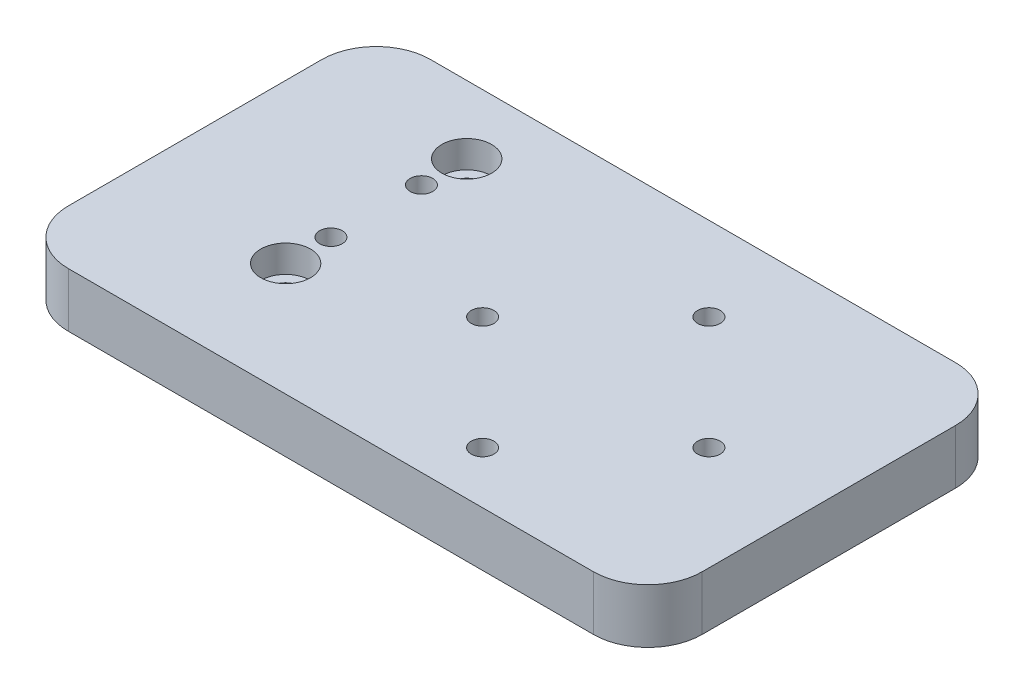
ISO-10303-21;
HEADER;
FILE_DESCRIPTION(('STEP AP214'),'2;1');
FILE_NAME('part.step','',(''),(''),'','','');
FILE_SCHEMA(('AUTOMOTIVE_DESIGN { 1 0 10303 214 1 1 1 1 }'));
ENDSEC;
DATA;
#1=APPLICATION_CONTEXT('core data for automotive mechanical design processes');
#2=APPLICATION_PROTOCOL_DEFINITION('international standard','automotive_design',2000,#1);
#3=PRODUCT_CONTEXT('',#1,'mechanical');
#4=PRODUCT('Part','Part','',(#3));
#5=PRODUCT_RELATED_PRODUCT_CATEGORY('part','',(#4));
#6=PRODUCT_DEFINITION_FORMATION('','',#4);
#7=PRODUCT_DEFINITION_CONTEXT('part definition',#1,'design');
#8=PRODUCT_DEFINITION('design','',#6,#7);
#9=PRODUCT_DEFINITION_SHAPE('','',#8);
#10=(LENGTH_UNIT() NAMED_UNIT(*) SI_UNIT(.MILLI.,.METRE.));
#11=(NAMED_UNIT(*) PLANE_ANGLE_UNIT() SI_UNIT($,.RADIAN.));
#12=(NAMED_UNIT(*) SI_UNIT($,.STERADIAN.) SOLID_ANGLE_UNIT());
#13=UNCERTAINTY_MEASURE_WITH_UNIT(LENGTH_MEASURE(1.E-05),#10,'distance_accuracy_value','');
#14=(GEOMETRIC_REPRESENTATION_CONTEXT(3) GLOBAL_UNCERTAINTY_ASSIGNED_CONTEXT((#13)) GLOBAL_UNIT_ASSIGNED_CONTEXT((#10,
#11,#12)) REPRESENTATION_CONTEXT('',''));
#15=CARTESIAN_POINT('',(0.,0.,0.));
#16=DIRECTION('',(0.,0.,1.));
#17=DIRECTION('',(1.,0.,0.));
#18=AXIS2_PLACEMENT_3D('',#15,#16,#17);
#19=CARTESIAN_POINT('',(0.,12.,0.));
#20=DIRECTION('',(0.,-1.,0.));
#21=DIRECTION('',(0.,0.,-1.));
#22=AXIS2_PLACEMENT_3D('',#19,#20,#21);
#23=PLANE('',#22);
#24=CARTESIAN_POINT('',(-35.,12.,-15.));
#25=DIRECTION('',(0.,1.,0.));
#26=DIRECTION('',(0.,0.,1.));
#27=AXIS2_PLACEMENT_3D('',#24,#25,#26);
#28=CIRCLE('',#27,2.5);
#29=CARTESIAN_POINT('',(-35.,12.,-12.5));
#30=VERTEX_POINT('',#29);
#31=EDGE_CURVE('E226',#30,#30,#28,.T.);
#32=ORIENTED_EDGE('',*,*,#31,.F.);
#33=EDGE_LOOP('',(#32));
#34=FACE_BOUND('',#33,.T.);
#35=CARTESIAN_POINT('',(-35.,12.,5.00000000000001));
#36=DIRECTION('',(0.,1.,0.));
#37=DIRECTION('',(0.,0.,1.));
#38=AXIS2_PLACEMENT_3D('',#35,#36,#37);
#39=CIRCLE('',#38,2.5);
#40=CARTESIAN_POINT('',(-35.,12.,7.50000000000001));
#41=VERTEX_POINT('',#40);
#42=EDGE_CURVE('E220',#41,#41,#39,.T.);
#43=ORIENTED_EDGE('',*,*,#42,.F.);
#44=EDGE_LOOP('',(#43));
#45=FACE_BOUND('',#44,.T.);
#46=CARTESIAN_POINT('',(-35.,12.,-25.));
#47=DIRECTION('',(0.,1.,0.));
#48=DIRECTION('',(0.,0.,1.));
#49=AXIS2_PLACEMENT_3D('',#46,#47,#48);
#50=CIRCLE('',#49,5.5);
#51=CARTESIAN_POINT('',(-35.,12.,-19.5));
#52=VERTEX_POINT('',#51);
#53=EDGE_CURVE('E203',#52,#52,#50,.T.);
#54=ORIENTED_EDGE('',*,*,#53,.F.);
#55=EDGE_LOOP('',(#54));
#56=FACE_BOUND('',#55,.T.);
#57=CARTESIAN_POINT('',(-35.,12.,15.));
#58=DIRECTION('',(0.,1.,0.));
#59=DIRECTION('',(0.,0.,1.));
#60=AXIS2_PLACEMENT_3D('',#57,#58,#59);
#61=CIRCLE('',#60,5.5);
#62=CARTESIAN_POINT('',(-35.,12.,20.5));
#63=VERTEX_POINT('',#62);
#64=EDGE_CURVE('E196',#63,#63,#61,.T.);
#65=ORIENTED_EDGE('',*,*,#64,.F.);
#66=EDGE_LOOP('',(#65));
#67=FACE_BOUND('',#66,.T.);
#68=DIRECTION('',(0.,0.,1.));
#69=VECTOR('',#68,1.);
#70=CARTESIAN_POINT('',(-70.,12.,40.));
#71=LINE('',#70,#69);
#72=CARTESIAN_POINT('',(-70.,12.,-28.));
#73=VERTEX_POINT('',#72);
#74=CARTESIAN_POINT('',(-70.,12.,28.));
#75=VERTEX_POINT('',#74);
#76=EDGE_CURVE('E171',#73,#75,#71,.T.);
#77=ORIENTED_EDGE('',*,*,#76,.T.);
#78=CARTESIAN_POINT('',(-58.,12.,28.));
#79=DIRECTION('',(0.,-1.,0.));
#80=DIRECTION('',(0.,0.,-1.));
#81=AXIS2_PLACEMENT_3D('',#78,#79,#80);
#82=CIRCLE('',#81,12.);
#83=CARTESIAN_POINT('',(-58.,12.,40.));
#84=VERTEX_POINT('',#83);
#85=EDGE_CURVE('E148',#75,#84,#82,.F.);
#86=ORIENTED_EDGE('',*,*,#85,.T.);
#87=DIRECTION('',(1.,0.,0.));
#88=VECTOR('',#87,1.);
#89=CARTESIAN_POINT('',(-70.,12.,40.));
#90=LINE('',#89,#88);
#91=CARTESIAN_POINT('',(58.,12.,40.));
#92=VERTEX_POINT('',#91);
#93=EDGE_CURVE('E119',#84,#92,#90,.T.);
#94=ORIENTED_EDGE('',*,*,#93,.T.);
#95=CARTESIAN_POINT('',(58.,12.,28.));
#96=DIRECTION('',(0.,-1.,0.));
#97=DIRECTION('',(0.,0.,-1.));
#98=AXIS2_PLACEMENT_3D('',#95,#96,#97);
#99=CIRCLE('',#98,12.);
#100=CARTESIAN_POINT('',(70.,12.,28.));
#101=VERTEX_POINT('',#100);
#102=EDGE_CURVE('E143',#92,#101,#99,.F.);
#103=ORIENTED_EDGE('',*,*,#102,.T.);
#104=DIRECTION('',(0.,0.,-1.));
#105=VECTOR('',#104,1.);
#106=CARTESIAN_POINT('',(70.,12.,40.));
#107=LINE('',#106,#105);
#108=CARTESIAN_POINT('',(70.,12.,-28.));
#109=VERTEX_POINT('',#108);
#110=EDGE_CURVE('E126',#101,#109,#107,.T.);
#111=ORIENTED_EDGE('',*,*,#110,.T.);
#112=CARTESIAN_POINT('',(58.,12.,-28.));
#113=DIRECTION('',(0.,-1.,0.));
#114=DIRECTION('',(0.,0.,-1.));
#115=AXIS2_PLACEMENT_3D('',#112,#113,#114);
#116=CIRCLE('',#115,12.);
#117=CARTESIAN_POINT('',(58.,12.,-40.));
#118=VERTEX_POINT('',#117);
#119=EDGE_CURVE('E55',#109,#118,#116,.F.);
#120=ORIENTED_EDGE('',*,*,#119,.T.);
#121=DIRECTION('',(-1.,0.,0.));
#122=VECTOR('',#121,1.);
#123=CARTESIAN_POINT('',(-70.,12.,-40.));
#124=LINE('',#123,#122);
#125=CARTESIAN_POINT('',(-58.,12.,-40.));
#126=VERTEX_POINT('',#125);
#127=EDGE_CURVE('E129',#118,#126,#124,.T.);
#128=ORIENTED_EDGE('',*,*,#127,.T.);
#129=CARTESIAN_POINT('',(-58.,12.,-28.));
#130=DIRECTION('',(0.,-1.,0.));
#131=DIRECTION('',(0.,0.,-1.));
#132=AXIS2_PLACEMENT_3D('',#129,#130,#131);
#133=CIRCLE('',#132,12.);
#134=EDGE_CURVE('E146',#126,#73,#133,.F.);
#135=ORIENTED_EDGE('',*,*,#134,.T.);
#136=EDGE_LOOP('',(#77,#86,#94,#103,#111,#120,#128,#135));
#137=FACE_BOUND('',#136,.T.);
#138=CARTESIAN_POINT('',(22.,12.,-21.5));
#139=DIRECTION('',(0.,1.,0.));
#140=DIRECTION('',(0.,0.,1.));
#141=AXIS2_PLACEMENT_3D('',#138,#139,#140);
#142=CIRCLE('',#141,2.5);
#143=CARTESIAN_POINT('',(22.,12.,-19.));
#144=VERTEX_POINT('',#143);
#145=EDGE_CURVE('E164',#144,#144,#142,.T.);
#146=ORIENTED_EDGE('',*,*,#145,.F.);
#147=EDGE_LOOP('',(#146));
#148=FACE_BOUND('',#147,.T.);
#149=CARTESIAN_POINT('',(47.,12.,3.50000000000001));
#150=DIRECTION('',(0.,1.,0.));
#151=DIRECTION('',(0.,0.,1.));
#152=AXIS2_PLACEMENT_3D('',#149,#150,#151);
#153=CIRCLE('',#152,2.5);
#154=CARTESIAN_POINT('',(47.,12.,6.00000000000001));
#155=VERTEX_POINT('',#154);
#156=EDGE_CURVE('E176',#155,#155,#153,.T.);
#157=ORIENTED_EDGE('',*,*,#156,.F.);
#158=EDGE_LOOP('',(#157));
#159=FACE_BOUND('',#158,.T.);
#160=CARTESIAN_POINT('',(-3.,12.,3.50000000000001));
#161=DIRECTION('',(0.,1.,0.));
#162=DIRECTION('',(0.,0.,1.));
#163=AXIS2_PLACEMENT_3D('',#160,#161,#162);
#164=CIRCLE('',#163,2.5);
#165=CARTESIAN_POINT('',(-3.,12.,6.00000000000001));
#166=VERTEX_POINT('',#165);
#167=EDGE_CURVE('E181',#166,#166,#164,.T.);
#168=ORIENTED_EDGE('',*,*,#167,.F.);
#169=EDGE_LOOP('',(#168));
#170=FACE_BOUND('',#169,.T.);
#171=CARTESIAN_POINT('',(22.,12.,28.5));
#172=DIRECTION('',(0.,1.,0.));
#173=DIRECTION('',(0.,0.,1.));
#174=AXIS2_PLACEMENT_3D('',#171,#172,#173);
#175=CIRCLE('',#174,2.5);
#176=CARTESIAN_POINT('',(22.,12.,31.));
#177=VERTEX_POINT('',#176);
#178=EDGE_CURVE('E187',#177,#177,#175,.T.);
#179=ORIENTED_EDGE('',*,*,#178,.F.);
#180=EDGE_LOOP('',(#179));
#181=FACE_BOUND('',#180,.T.);
#182=ADVANCED_FACE('F33',(#34,#45,#56,#67,#137,#148,#159,#170,#181),#23,.F.);
#183=CARTESIAN_POINT('',(0.,0.,0.));
#184=DIRECTION('',(0.,-1.,0.));
#185=DIRECTION('',(0.,0.,-1.));
#186=AXIS2_PLACEMENT_3D('',#183,#184,#185);
#187=PLANE('',#186);
#188=CARTESIAN_POINT('',(-35.,0.,-15.));
#189=DIRECTION('',(0.,1.,0.));
#190=DIRECTION('',(0.,0.,1.));
#191=AXIS2_PLACEMENT_3D('',#188,#189,#190);
#192=CIRCLE('',#191,2.5);
#193=CARTESIAN_POINT('',(-35.,0.,-12.5));
#194=VERTEX_POINT('',#193);
#195=EDGE_CURVE('E212',#194,#194,#192,.T.);
#196=ORIENTED_EDGE('',*,*,#195,.T.);
#197=EDGE_LOOP('',(#196));
#198=FACE_BOUND('',#197,.T.);
#199=CARTESIAN_POINT('',(-35.,0.,5.00000000000001));
#200=DIRECTION('',(0.,1.,0.));
#201=DIRECTION('',(0.,0.,1.));
#202=AXIS2_PLACEMENT_3D('',#199,#200,#201);
#203=CIRCLE('',#202,2.5);
#204=CARTESIAN_POINT('',(-35.,0.,7.50000000000001));
#205=VERTEX_POINT('',#204);
#206=EDGE_CURVE('E223',#205,#205,#203,.T.);
#207=ORIENTED_EDGE('',*,*,#206,.T.);
#208=EDGE_LOOP('',(#207));
#209=FACE_BOUND('',#208,.T.);
#210=CARTESIAN_POINT('',(-35.,0.,-25.));
#211=DIRECTION('',(0.,1.,0.));
#212=DIRECTION('',(0.,0.,1.));
#213=AXIS2_PLACEMENT_3D('',#210,#211,#212);
#214=CIRCLE('',#213,3.25);
#215=CARTESIAN_POINT('',(-35.,0.,-21.75));
#216=VERTEX_POINT('',#215);
#217=EDGE_CURVE('E200',#216,#216,#214,.T.);
#218=ORIENTED_EDGE('',*,*,#217,.T.);
#219=EDGE_LOOP('',(#218));
#220=FACE_BOUND('',#219,.T.);
#221=CARTESIAN_POINT('',(-35.,0.,15.));
#222=DIRECTION('',(0.,1.,0.));
#223=DIRECTION('',(0.,0.,1.));
#224=AXIS2_PLACEMENT_3D('',#221,#222,#223);
#225=CIRCLE('',#224,3.25);
#226=CARTESIAN_POINT('',(-35.,0.,18.25));
#227=VERTEX_POINT('',#226);
#228=EDGE_CURVE('E211',#227,#227,#225,.T.);
#229=ORIENTED_EDGE('',*,*,#228,.T.);
#230=EDGE_LOOP('',(#229));
#231=FACE_BOUND('',#230,.T.);
#232=CARTESIAN_POINT('',(-3.,0.,3.50000000000001));
#233=DIRECTION('',(0.,1.,0.));
#234=DIRECTION('',(0.,0.,1.));
#235=AXIS2_PLACEMENT_3D('',#232,#233,#234);
#236=CIRCLE('',#235,2.5);
#237=CARTESIAN_POINT('',(-3.,0.,6.00000000000001));
#238=VERTEX_POINT('',#237);
#239=EDGE_CURVE('E184',#238,#238,#236,.T.);
#240=ORIENTED_EDGE('',*,*,#239,.T.);
#241=EDGE_LOOP('',(#240));
#242=FACE_BOUND('',#241,.T.);
#243=CARTESIAN_POINT('',(22.,0.,-21.5));
#244=DIRECTION('',(0.,1.,0.));
#245=DIRECTION('',(0.,0.,1.));
#246=AXIS2_PLACEMENT_3D('',#243,#244,#245);
#247=CIRCLE('',#246,2.5);
#248=CARTESIAN_POINT('',(22.,0.,-19.));
#249=VERTEX_POINT('',#248);
#250=EDGE_CURVE('E167',#249,#249,#247,.T.);
#251=ORIENTED_EDGE('',*,*,#250,.T.);
#252=EDGE_LOOP('',(#251));
#253=FACE_BOUND('',#252,.T.);
#254=DIRECTION('',(1.,0.,0.));
#255=VECTOR('',#254,1.);
#256=CARTESIAN_POINT('',(-70.,0.,40.));
#257=LINE('',#256,#255);
#258=CARTESIAN_POINT('',(-58.,0.,40.));
#259=VERTEX_POINT('',#258);
#260=CARTESIAN_POINT('',(58.,0.,40.));
#261=VERTEX_POINT('',#260);
#262=EDGE_CURVE('E116',#259,#261,#257,.T.);
#263=ORIENTED_EDGE('',*,*,#262,.F.);
#264=CARTESIAN_POINT('',(-58.,0.,28.));
#265=DIRECTION('',(0.,-1.,0.));
#266=DIRECTION('',(0.,0.,-1.));
#267=AXIS2_PLACEMENT_3D('',#264,#265,#266);
#268=CIRCLE('',#267,12.);
#269=CARTESIAN_POINT('',(-70.,0.,28.));
#270=VERTEX_POINT('',#269);
#271=EDGE_CURVE('E99',#259,#270,#268,.T.);
#272=ORIENTED_EDGE('',*,*,#271,.T.);
#273=DIRECTION('',(0.,0.,1.));
#274=VECTOR('',#273,1.);
#275=CARTESIAN_POINT('',(-70.,0.,40.));
#276=LINE('',#275,#274);
#277=CARTESIAN_POINT('',(-70.,0.,-28.));
#278=VERTEX_POINT('',#277);
#279=EDGE_CURVE('E127',#278,#270,#276,.T.);
#280=ORIENTED_EDGE('',*,*,#279,.F.);
#281=CARTESIAN_POINT('',(-58.,0.,-28.));
#282=DIRECTION('',(0.,-1.,0.));
#283=DIRECTION('',(0.,0.,-1.));
#284=AXIS2_PLACEMENT_3D('',#281,#282,#283);
#285=CIRCLE('',#284,12.);
#286=CARTESIAN_POINT('',(-58.,0.,-40.));
#287=VERTEX_POINT('',#286);
#288=EDGE_CURVE('E110',#278,#287,#285,.T.);
#289=ORIENTED_EDGE('',*,*,#288,.T.);
#290=DIRECTION('',(-1.,0.,0.));
#291=VECTOR('',#290,1.);
#292=CARTESIAN_POINT('',(-70.,0.,-40.));
#293=LINE('',#292,#291);
#294=CARTESIAN_POINT('',(58.,0.,-40.));
#295=VERTEX_POINT('',#294);
#296=EDGE_CURVE('E131',#295,#287,#293,.T.);
#297=ORIENTED_EDGE('',*,*,#296,.F.);
#298=CARTESIAN_POINT('',(58.,0.,-28.));
#299=DIRECTION('',(0.,-1.,0.));
#300=DIRECTION('',(0.,0.,-1.));
#301=AXIS2_PLACEMENT_3D('',#298,#299,#300);
#302=CIRCLE('',#301,12.);
#303=CARTESIAN_POINT('',(70.,0.,-28.));
#304=VERTEX_POINT('',#303);
#305=EDGE_CURVE('E137',#295,#304,#302,.T.);
#306=ORIENTED_EDGE('',*,*,#305,.T.);
#307=DIRECTION('',(0.,0.,-1.));
#308=VECTOR('',#307,1.);
#309=CARTESIAN_POINT('',(70.,0.,40.));
#310=LINE('',#309,#308);
#311=CARTESIAN_POINT('',(70.,0.,28.));
#312=VERTEX_POINT('',#311);
#313=EDGE_CURVE('E159',#312,#304,#310,.T.);
#314=ORIENTED_EDGE('',*,*,#313,.F.);
#315=CARTESIAN_POINT('',(58.,0.,28.));
#316=DIRECTION('',(0.,-1.,0.));
#317=DIRECTION('',(0.,0.,-1.));
#318=AXIS2_PLACEMENT_3D('',#315,#316,#317);
#319=CIRCLE('',#318,12.);
#320=EDGE_CURVE('E120',#312,#261,#319,.T.);
#321=ORIENTED_EDGE('',*,*,#320,.T.);
#322=EDGE_LOOP('',(#263,#272,#280,#289,#297,#306,#314,#321));
#323=FACE_BOUND('',#322,.T.);
#324=CARTESIAN_POINT('',(47.,0.,3.50000000000001));
#325=DIRECTION('',(0.,1.,0.));
#326=DIRECTION('',(0.,0.,1.));
#327=AXIS2_PLACEMENT_3D('',#324,#325,#326);
#328=CIRCLE('',#327,2.5);
#329=CARTESIAN_POINT('',(47.,0.,6.00000000000001));
#330=VERTEX_POINT('',#329);
#331=EDGE_CURVE('E178',#330,#330,#328,.T.);
#332=ORIENTED_EDGE('',*,*,#331,.T.);
#333=EDGE_LOOP('',(#332));
#334=FACE_BOUND('',#333,.T.);
#335=CARTESIAN_POINT('',(22.,0.,28.5));
#336=DIRECTION('',(0.,1.,0.));
#337=DIRECTION('',(0.,0.,1.));
#338=AXIS2_PLACEMENT_3D('',#335,#336,#337);
#339=CIRCLE('',#338,2.5);
#340=CARTESIAN_POINT('',(22.,0.,31.));
#341=VERTEX_POINT('',#340);
#342=EDGE_CURVE('E190',#341,#341,#339,.T.);
#343=ORIENTED_EDGE('',*,*,#342,.T.);
#344=EDGE_LOOP('',(#343));
#345=FACE_BOUND('',#344,.T.);
#346=ADVANCED_FACE('F123',(#198,#209,#220,#231,#242,#253,#323,#334,#345),#187,.T.);
#347=CARTESIAN_POINT('',(70.,12.,40.));
#348=DIRECTION('',(-1.,0.,0.));
#349=DIRECTION('',(0.,0.,1.));
#350=AXIS2_PLACEMENT_3D('',#347,#348,#349);
#351=PLANE('',#350);
#352=ORIENTED_EDGE('',*,*,#313,.T.);
#353=DIRECTION('',(0.,-1.,0.));
#354=VECTOR('',#353,1.);
#355=CARTESIAN_POINT('',(70.,12.,-28.));
#356=LINE('',#355,#354);
#357=EDGE_CURVE('E11',#304,#109,#356,.F.);
#358=ORIENTED_EDGE('',*,*,#357,.T.);
#359=ORIENTED_EDGE('',*,*,#110,.F.);
#360=DIRECTION('',(0.,-1.,0.));
#361=VECTOR('',#360,1.);
#362=CARTESIAN_POINT('',(70.,12.,28.));
#363=LINE('',#362,#361);
#364=EDGE_CURVE('E41',#101,#312,#363,.T.);
#365=ORIENTED_EDGE('',*,*,#364,.T.);
#366=EDGE_LOOP('',(#352,#358,#359,#365));
#367=FACE_BOUND('',#366,.T.);
#368=ADVANCED_FACE('F158',(#367),#351,.F.);
#369=CARTESIAN_POINT('',(-70.,12.,-40.));
#370=DIRECTION('',(0.,0.,1.));
#371=DIRECTION('',(1.,0.,0.));
#372=AXIS2_PLACEMENT_3D('',#369,#370,#371);
#373=PLANE('',#372);
#374=ORIENTED_EDGE('',*,*,#296,.T.);
#375=DIRECTION('',(0.,-1.,0.));
#376=VECTOR('',#375,1.);
#377=CARTESIAN_POINT('',(-58.,12.,-40.));
#378=LINE('',#377,#376);
#379=EDGE_CURVE('E48',#287,#126,#378,.F.);
#380=ORIENTED_EDGE('',*,*,#379,.T.);
#381=ORIENTED_EDGE('',*,*,#127,.F.);
#382=DIRECTION('',(0.,-1.,0.));
#383=VECTOR('',#382,1.);
#384=CARTESIAN_POINT('',(58.,12.,-40.));
#385=LINE('',#384,#383);
#386=EDGE_CURVE('E150',#118,#295,#385,.T.);
#387=ORIENTED_EDGE('',*,*,#386,.T.);
#388=EDGE_LOOP('',(#374,#380,#381,#387));
#389=FACE_BOUND('',#388,.T.);
#390=ADVANCED_FACE('F271',(#389),#373,.F.);
#391=CARTESIAN_POINT('',(-70.,12.,40.));
#392=DIRECTION('',(1.,0.,0.));
#393=DIRECTION('',(0.,0.,-1.));
#394=AXIS2_PLACEMENT_3D('',#391,#392,#393);
#395=PLANE('',#394);
#396=ORIENTED_EDGE('',*,*,#279,.T.);
#397=DIRECTION('',(0.,-1.,0.));
#398=VECTOR('',#397,1.);
#399=CARTESIAN_POINT('',(-70.,12.,28.));
#400=LINE('',#399,#398);
#401=EDGE_CURVE('E104',#270,#75,#400,.F.);
#402=ORIENTED_EDGE('',*,*,#401,.T.);
#403=ORIENTED_EDGE('',*,*,#76,.F.);
#404=DIRECTION('',(0.,-1.,0.));
#405=VECTOR('',#404,1.);
#406=CARTESIAN_POINT('',(-70.,12.,-28.));
#407=LINE('',#406,#405);
#408=EDGE_CURVE('E109',#73,#278,#407,.T.);
#409=ORIENTED_EDGE('',*,*,#408,.T.);
#410=EDGE_LOOP('',(#396,#402,#403,#409));
#411=FACE_BOUND('',#410,.T.);
#412=ADVANCED_FACE('F278',(#411),#395,.F.);
#413=CARTESIAN_POINT('',(-70.,12.,40.));
#414=DIRECTION('',(0.,0.,-1.));
#415=DIRECTION('',(-1.,0.,0.));
#416=AXIS2_PLACEMENT_3D('',#413,#414,#415);
#417=PLANE('',#416);
#418=ORIENTED_EDGE('',*,*,#93,.F.);
#419=DIRECTION('',(0.,-1.,0.));
#420=VECTOR('',#419,1.);
#421=CARTESIAN_POINT('',(-58.,12.,40.));
#422=LINE('',#421,#420);
#423=EDGE_CURVE('E103',#84,#259,#422,.T.);
#424=ORIENTED_EDGE('',*,*,#423,.T.);
#425=ORIENTED_EDGE('',*,*,#262,.T.);
#426=DIRECTION('',(0.,-1.,0.));
#427=VECTOR('',#426,1.);
#428=CARTESIAN_POINT('',(58.,12.,40.));
#429=LINE('',#428,#427);
#430=EDGE_CURVE('E121',#261,#92,#429,.F.);
#431=ORIENTED_EDGE('',*,*,#430,.T.);
#432=EDGE_LOOP('',(#418,#424,#425,#431));
#433=FACE_BOUND('',#432,.T.);
#434=ADVANCED_FACE('F115',(#433),#417,.F.);
#435=CARTESIAN_POINT('',(22.,12.,-21.5));
#436=DIRECTION('',(0.,-1.,0.));
#437=DIRECTION('',(0.,0.,-1.));
#438=AXIS2_PLACEMENT_3D('',#435,#436,#437);
#439=CYLINDRICAL_SURFACE('',#438,2.5);
#440=ORIENTED_EDGE('',*,*,#145,.T.);
#441=EDGE_LOOP('',(#440));
#442=FACE_BOUND('',#441,.T.);
#443=ORIENTED_EDGE('',*,*,#250,.F.);
#444=EDGE_LOOP('',(#443));
#445=FACE_BOUND('',#444,.T.);
#446=ADVANCED_FACE('F277',(#442,#445),#439,.F.);
#447=CARTESIAN_POINT('',(47.,12.,3.50000000000001));
#448=DIRECTION('',(0.,-1.,0.));
#449=DIRECTION('',(0.,0.,-1.));
#450=AXIS2_PLACEMENT_3D('',#447,#448,#449);
#451=CYLINDRICAL_SURFACE('',#450,2.5);
#452=ORIENTED_EDGE('',*,*,#156,.T.);
#453=EDGE_LOOP('',(#452));
#454=FACE_BOUND('',#453,.T.);
#455=ORIENTED_EDGE('',*,*,#331,.F.);
#456=EDGE_LOOP('',(#455));
#457=FACE_BOUND('',#456,.T.);
#458=ADVANCED_FACE('F317',(#454,#457),#451,.F.);
#459=CARTESIAN_POINT('',(-3.,12.,3.50000000000001));
#460=DIRECTION('',(0.,-1.,0.));
#461=DIRECTION('',(0.,0.,-1.));
#462=AXIS2_PLACEMENT_3D('',#459,#460,#461);
#463=CYLINDRICAL_SURFACE('',#462,2.5);
#464=ORIENTED_EDGE('',*,*,#167,.T.);
#465=EDGE_LOOP('',(#464));
#466=FACE_BOUND('',#465,.T.);
#467=ORIENTED_EDGE('',*,*,#239,.F.);
#468=EDGE_LOOP('',(#467));
#469=FACE_BOUND('',#468,.T.);
#470=ADVANCED_FACE('F262',(#466,#469),#463,.F.);
#471=CARTESIAN_POINT('',(22.,12.,28.5));
#472=DIRECTION('',(0.,-1.,0.));
#473=DIRECTION('',(0.,0.,-1.));
#474=AXIS2_PLACEMENT_3D('',#471,#472,#473);
#475=CYLINDRICAL_SURFACE('',#474,2.5);
#476=ORIENTED_EDGE('',*,*,#178,.T.);
#477=EDGE_LOOP('',(#476));
#478=FACE_BOUND('',#477,.T.);
#479=ORIENTED_EDGE('',*,*,#342,.F.);
#480=EDGE_LOOP('',(#479));
#481=FACE_BOUND('',#480,.T.);
#482=ADVANCED_FACE('F259',(#478,#481),#475,.F.);
#483=CARTESIAN_POINT('',(-58.,12.,28.));
#484=DIRECTION('',(0.,-1.,0.));
#485=DIRECTION('',(0.,0.,-1.));
#486=AXIS2_PLACEMENT_3D('',#483,#484,#485);
#487=CYLINDRICAL_SURFACE('',#486,12.);
#488=ORIENTED_EDGE('',*,*,#85,.F.);
#489=ORIENTED_EDGE('',*,*,#401,.F.);
#490=ORIENTED_EDGE('',*,*,#271,.F.);
#491=ORIENTED_EDGE('',*,*,#423,.F.);
#492=EDGE_LOOP('',(#488,#489,#490,#491));
#493=FACE_BOUND('',#492,.T.);
#494=ADVANCED_FACE('F102',(#493),#487,.T.);
#495=CARTESIAN_POINT('',(-58.,12.,-28.));
#496=DIRECTION('',(0.,-1.,0.));
#497=DIRECTION('',(0.,0.,-1.));
#498=AXIS2_PLACEMENT_3D('',#495,#496,#497);
#499=CYLINDRICAL_SURFACE('',#498,12.);
#500=ORIENTED_EDGE('',*,*,#134,.F.);
#501=ORIENTED_EDGE('',*,*,#379,.F.);
#502=ORIENTED_EDGE('',*,*,#288,.F.);
#503=ORIENTED_EDGE('',*,*,#408,.F.);
#504=EDGE_LOOP('',(#500,#501,#502,#503));
#505=FACE_BOUND('',#504,.T.);
#506=ADVANCED_FACE('F286',(#505),#499,.T.);
#507=CARTESIAN_POINT('',(58.,12.,-28.));
#508=DIRECTION('',(0.,-1.,0.));
#509=DIRECTION('',(0.,0.,-1.));
#510=AXIS2_PLACEMENT_3D('',#507,#508,#509);
#511=CYLINDRICAL_SURFACE('',#510,12.);
#512=ORIENTED_EDGE('',*,*,#119,.F.);
#513=ORIENTED_EDGE('',*,*,#357,.F.);
#514=ORIENTED_EDGE('',*,*,#305,.F.);
#515=ORIENTED_EDGE('',*,*,#386,.F.);
#516=EDGE_LOOP('',(#512,#513,#514,#515));
#517=FACE_BOUND('',#516,.T.);
#518=ADVANCED_FACE('F288',(#517),#511,.T.);
#519=CARTESIAN_POINT('',(58.,12.,28.));
#520=DIRECTION('',(0.,-1.,0.));
#521=DIRECTION('',(0.,0.,-1.));
#522=AXIS2_PLACEMENT_3D('',#519,#520,#521);
#523=CYLINDRICAL_SURFACE('',#522,12.);
#524=ORIENTED_EDGE('',*,*,#102,.F.);
#525=ORIENTED_EDGE('',*,*,#430,.F.);
#526=ORIENTED_EDGE('',*,*,#320,.F.);
#527=ORIENTED_EDGE('',*,*,#364,.F.);
#528=EDGE_LOOP('',(#524,#525,#526,#527));
#529=FACE_BOUND('',#528,.T.);
#530=ADVANCED_FACE('F35',(#529),#523,.T.);
#531=CARTESIAN_POINT('',(-35.,6.,15.));
#532=DIRECTION('',(0.,1.,0.));
#533=DIRECTION('',(0.,0.,1.));
#534=AXIS2_PLACEMENT_3D('',#531,#532,#533);
#535=CYLINDRICAL_SURFACE('',#534,5.5);
#536=CARTESIAN_POINT('',(-35.,6.,15.));
#537=DIRECTION('',(0.,1.,0.));
#538=DIRECTION('',(0.,0.,1.));
#539=AXIS2_PLACEMENT_3D('',#536,#537,#538);
#540=CIRCLE('',#539,5.5);
#541=CARTESIAN_POINT('',(-35.,6.,20.5));
#542=VERTEX_POINT('',#541);
#543=EDGE_CURVE('E199',#542,#542,#540,.T.);
#544=ORIENTED_EDGE('',*,*,#543,.F.);
#545=EDGE_LOOP('',(#544));
#546=FACE_BOUND('',#545,.T.);
#547=ORIENTED_EDGE('',*,*,#64,.T.);
#548=EDGE_LOOP('',(#547));
#549=FACE_BOUND('',#548,.T.);
#550=ADVANCED_FACE('F295',(#546,#549),#535,.F.);
#551=CARTESIAN_POINT('',(-35.,6.,15.));
#552=DIRECTION('',(0.,1.,0.));
#553=DIRECTION('',(0.,0.,1.));
#554=AXIS2_PLACEMENT_3D('',#551,#552,#553);
#555=PLANE('',#554);
#556=CARTESIAN_POINT('',(-35.,6.,15.));
#557=DIRECTION('',(0.,1.,0.));
#558=DIRECTION('',(0.,0.,1.));
#559=AXIS2_PLACEMENT_3D('',#556,#557,#558);
#560=CIRCLE('',#559,3.25);
#561=CARTESIAN_POINT('',(-35.,6.,18.25));
#562=VERTEX_POINT('',#561);
#563=EDGE_CURVE('E208',#562,#562,#560,.T.);
#564=ORIENTED_EDGE('',*,*,#563,.F.);
#565=EDGE_LOOP('',(#564));
#566=FACE_BOUND('',#565,.T.);
#567=ORIENTED_EDGE('',*,*,#543,.T.);
#568=EDGE_LOOP('',(#567));
#569=FACE_BOUND('',#568,.T.);
#570=ADVANCED_FACE('F302',(#566,#569),#555,.T.);
#571=CARTESIAN_POINT('',(-35.,6.,-25.));
#572=DIRECTION('',(0.,1.,0.));
#573=DIRECTION('',(0.,0.,1.));
#574=AXIS2_PLACEMENT_3D('',#571,#572,#573);
#575=CYLINDRICAL_SURFACE('',#574,5.5);
#576=CARTESIAN_POINT('',(-35.,6.,-25.));
#577=DIRECTION('',(0.,1.,0.));
#578=DIRECTION('',(0.,0.,1.));
#579=AXIS2_PLACEMENT_3D('',#576,#577,#578);
#580=CIRCLE('',#579,5.5);
#581=CARTESIAN_POINT('',(-35.,6.,-19.5));
#582=VERTEX_POINT('',#581);
#583=EDGE_CURVE('E193',#582,#582,#580,.T.);
#584=ORIENTED_EDGE('',*,*,#583,.F.);
#585=EDGE_LOOP('',(#584));
#586=FACE_BOUND('',#585,.T.);
#587=ORIENTED_EDGE('',*,*,#53,.T.);
#588=EDGE_LOOP('',(#587));
#589=FACE_BOUND('',#588,.T.);
#590=ADVANCED_FACE('F308',(#586,#589),#575,.F.);
#591=CARTESIAN_POINT('',(-35.,6.,-25.));
#592=DIRECTION('',(0.,1.,0.));
#593=DIRECTION('',(0.,0.,1.));
#594=AXIS2_PLACEMENT_3D('',#591,#592,#593);
#595=PLANE('',#594);
#596=CARTESIAN_POINT('',(-35.,6.,-25.));
#597=DIRECTION('',(0.,1.,0.));
#598=DIRECTION('',(0.,0.,1.));
#599=AXIS2_PLACEMENT_3D('',#596,#597,#598);
#600=CIRCLE('',#599,3.25);
#601=CARTESIAN_POINT('',(-35.,6.,-21.75));
#602=VERTEX_POINT('',#601);
#603=EDGE_CURVE('E215',#602,#602,#600,.T.);
#604=ORIENTED_EDGE('',*,*,#603,.F.);
#605=EDGE_LOOP('',(#604));
#606=FACE_BOUND('',#605,.T.);
#607=ORIENTED_EDGE('',*,*,#583,.T.);
#608=EDGE_LOOP('',(#607));
#609=FACE_BOUND('',#608,.T.);
#610=ADVANCED_FACE('F373',(#606,#609),#595,.T.);
#611=CARTESIAN_POINT('',(-35.,0.,15.));
#612=DIRECTION('',(0.,1.,0.));
#613=DIRECTION('',(0.,0.,1.));
#614=AXIS2_PLACEMENT_3D('',#611,#612,#613);
#615=CYLINDRICAL_SURFACE('',#614,3.25);
#616=ORIENTED_EDGE('',*,*,#228,.F.);
#617=EDGE_LOOP('',(#616));
#618=FACE_BOUND('',#617,.T.);
#619=ORIENTED_EDGE('',*,*,#563,.T.);
#620=EDGE_LOOP('',(#619));
#621=FACE_BOUND('',#620,.T.);
#622=ADVANCED_FACE('F387',(#618,#621),#615,.F.);
#623=CARTESIAN_POINT('',(-35.,0.,-25.));
#624=DIRECTION('',(0.,1.,0.));
#625=DIRECTION('',(0.,0.,1.));
#626=AXIS2_PLACEMENT_3D('',#623,#624,#625);
#627=CYLINDRICAL_SURFACE('',#626,3.25);
#628=ORIENTED_EDGE('',*,*,#217,.F.);
#629=EDGE_LOOP('',(#628));
#630=FACE_BOUND('',#629,.T.);
#631=ORIENTED_EDGE('',*,*,#603,.T.);
#632=EDGE_LOOP('',(#631));
#633=FACE_BOUND('',#632,.T.);
#634=ADVANCED_FACE('F397',(#630,#633),#627,.F.);
#635=CARTESIAN_POINT('',(-35.,0.,5.00000000000001));
#636=DIRECTION('',(0.,1.,0.));
#637=DIRECTION('',(0.,0.,1.));
#638=AXIS2_PLACEMENT_3D('',#635,#636,#637);
#639=CYLINDRICAL_SURFACE('',#638,2.5);
#640=ORIENTED_EDGE('',*,*,#206,.F.);
#641=EDGE_LOOP('',(#640));
#642=FACE_BOUND('',#641,.T.);
#643=ORIENTED_EDGE('',*,*,#42,.T.);
#644=EDGE_LOOP('',(#643));
#645=FACE_BOUND('',#644,.T.);
#646=ADVANCED_FACE('F237',(#642,#645),#639,.F.);
#647=CARTESIAN_POINT('',(-35.,0.,-15.));
#648=DIRECTION('',(0.,1.,0.));
#649=DIRECTION('',(0.,0.,1.));
#650=AXIS2_PLACEMENT_3D('',#647,#648,#649);
#651=CYLINDRICAL_SURFACE('',#650,2.5);
#652=ORIENTED_EDGE('',*,*,#195,.F.);
#653=EDGE_LOOP('',(#652));
#654=FACE_BOUND('',#653,.T.);
#655=ORIENTED_EDGE('',*,*,#31,.T.);
#656=EDGE_LOOP('',(#655));
#657=FACE_BOUND('',#656,.T.);
#658=ADVANCED_FACE('F234',(#654,#657),#651,.F.);
#659=CLOSED_SHELL('',(#182,#346,#368,#390,#412,#434,#446,#458,#470,#482,#494,#506,#518,#530,
#550,#570,#590,#610,#622,#634,#646,#658));
#660=MANIFOLD_SOLID_BREP('B2',#659);
#661=ADVANCED_BREP_SHAPE_REPRESENTATION('',(#18,#660),#14);
#662=SHAPE_DEFINITION_REPRESENTATION(#9,#661);
ENDSEC;
END-ISO-10303-21;
